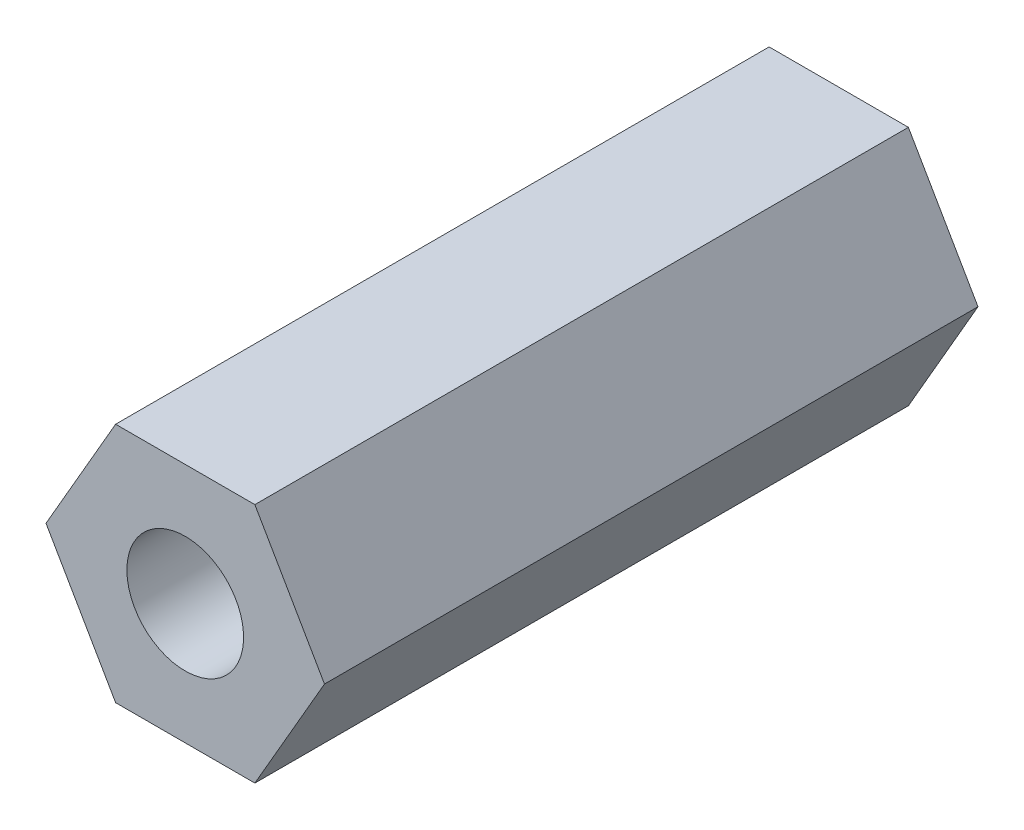
ISO-10303-21;
HEADER;
FILE_DESCRIPTION(('STEP AP214'),'2;1');
FILE_NAME('part.step','',(''),(''),'','','');
FILE_SCHEMA(('AUTOMOTIVE_DESIGN { 1 0 10303 214 1 1 1 1 }'));
ENDSEC;
DATA;
#1=APPLICATION_CONTEXT('core data for automotive mechanical design processes');
#2=APPLICATION_PROTOCOL_DEFINITION('international standard','automotive_design',2000,#1);
#3=PRODUCT_CONTEXT('',#1,'mechanical');
#4=PRODUCT('Part','Part','',(#3));
#5=PRODUCT_RELATED_PRODUCT_CATEGORY('part','',(#4));
#6=PRODUCT_DEFINITION_FORMATION('','',#4);
#7=PRODUCT_DEFINITION_CONTEXT('part definition',#1,'design');
#8=PRODUCT_DEFINITION('design','',#6,#7);
#9=PRODUCT_DEFINITION_SHAPE('','',#8);
#10=(LENGTH_UNIT() NAMED_UNIT(*) SI_UNIT(.MILLI.,.METRE.));
#11=(NAMED_UNIT(*) PLANE_ANGLE_UNIT() SI_UNIT($,.RADIAN.));
#12=(NAMED_UNIT(*) SI_UNIT($,.STERADIAN.) SOLID_ANGLE_UNIT());
#13=UNCERTAINTY_MEASURE_WITH_UNIT(LENGTH_MEASURE(1.E-05),#10,'distance_accuracy_value','');
#14=(GEOMETRIC_REPRESENTATION_CONTEXT(3) GLOBAL_UNCERTAINTY_ASSIGNED_CONTEXT((#13)) GLOBAL_UNIT_ASSIGNED_CONTEXT((#10,
#11,#12)) REPRESENTATION_CONTEXT('',''));
#15=CARTESIAN_POINT('',(0.,0.,0.));
#16=DIRECTION('',(0.,0.,1.));
#17=DIRECTION('',(1.,0.,0.));
#18=AXIS2_PLACEMENT_3D('',#15,#16,#17);
#19=CARTESIAN_POINT('',(0.,0.,0.));
#20=DIRECTION('',(0.,0.,1.));
#21=DIRECTION('',(1.,0.,0.));
#22=AXIS2_PLACEMENT_3D('',#19,#20,#21);
#23=PLANE('',#22);
#24=DIRECTION('',(1.,0.,0.));
#25=VECTOR('',#24,1.);
#26=CARTESIAN_POINT('',(-1.78978583448784,-3.1,0.));
#27=LINE('',#26,#25);
#28=CARTESIAN_POINT('',(-1.78978583448784,-3.1,0.));
#29=VERTEX_POINT('',#28);
#30=CARTESIAN_POINT('',(1.78978583448784,-3.1,0.));
#31=VERTEX_POINT('',#30);
#32=EDGE_CURVE('E48',#29,#31,#27,.T.);
#33=ORIENTED_EDGE('',*,*,#32,.F.);
#34=DIRECTION('',(0.5,-0.866025403784439,0.));
#35=VECTOR('',#34,1.);
#36=CARTESIAN_POINT('',(-3.57957166897568,0.,0.));
#37=LINE('',#36,#35);
#38=CARTESIAN_POINT('',(-3.57957166897568,0.,0.));
#39=VERTEX_POINT('',#38);
#40=EDGE_CURVE('E65',#39,#29,#37,.T.);
#41=ORIENTED_EDGE('',*,*,#40,.F.);
#42=DIRECTION('',(-0.5,-0.866025403784439,0.));
#43=VECTOR('',#42,1.);
#44=CARTESIAN_POINT('',(-1.78978583448784,3.1,0.));
#45=LINE('',#44,#43);
#46=CARTESIAN_POINT('',(-1.78978583448784,3.1,0.));
#47=VERTEX_POINT('',#46);
#48=EDGE_CURVE('E158',#47,#39,#45,.T.);
#49=ORIENTED_EDGE('',*,*,#48,.F.);
#50=DIRECTION('',(-1.,0.,0.));
#51=VECTOR('',#50,1.);
#52=CARTESIAN_POINT('',(1.78978583448784,3.1,0.));
#53=LINE('',#52,#51);
#54=CARTESIAN_POINT('',(1.78978583448784,3.1,0.));
#55=VERTEX_POINT('',#54);
#56=EDGE_CURVE('E85',#55,#47,#53,.T.);
#57=ORIENTED_EDGE('',*,*,#56,.F.);
#58=DIRECTION('',(-0.5,0.866025403784439,0.));
#59=VECTOR('',#58,1.);
#60=CARTESIAN_POINT('',(3.57957166897568,0.,0.));
#61=LINE('',#60,#59);
#62=CARTESIAN_POINT('',(3.57957166897568,0.,0.));
#63=VERTEX_POINT('',#62);
#64=EDGE_CURVE('E80',#63,#55,#61,.T.);
#65=ORIENTED_EDGE('',*,*,#64,.F.);
#66=DIRECTION('',(0.5,0.866025403784439,0.));
#67=VECTOR('',#66,1.);
#68=CARTESIAN_POINT('',(1.78978583448784,-3.1,0.));
#69=LINE('',#68,#67);
#70=EDGE_CURVE('E150',#31,#63,#69,.T.);
#71=ORIENTED_EDGE('',*,*,#70,.F.);
#72=EDGE_LOOP('',(#33,#41,#49,#57,#65,#71));
#73=FACE_BOUND('',#72,.T.);
#74=CARTESIAN_POINT('',(0.,0.,0.));
#75=DIRECTION('',(0.,0.,1.));
#76=DIRECTION('',(1.,0.,0.));
#77=AXIS2_PLACEMENT_3D('',#74,#75,#76);
#78=CIRCLE('',#77,1.85);
#79=CARTESIAN_POINT('',(1.85,-1.16102705726273E-08,0.));
#80=VERTEX_POINT('',#79);
#81=EDGE_CURVE('E11',#80,#80,#78,.T.);
#82=ORIENTED_EDGE('',*,*,#81,.T.);
#83=EDGE_LOOP('',(#82));
#84=FACE_BOUND('',#83,.T.);
#85=ADVANCED_FACE('F39',(#73,#84),#23,.F.);
#86=CARTESIAN_POINT('',(-1.78978583448784,-3.1,0.));
#87=DIRECTION('',(0.,-1.,0.));
#88=DIRECTION('',(0.,0.,-1.));
#89=AXIS2_PLACEMENT_3D('',#86,#87,#88);
#90=PLANE('',#89);
#91=DIRECTION('',(-1.,0.,0.));
#92=VECTOR('',#91,1.);
#93=CARTESIAN_POINT('',(-12.4874931480861,-3.1,16.8));
#94=LINE('',#93,#92);
#95=CARTESIAN_POINT('',(1.78978583448784,-3.1,16.8));
#96=VERTEX_POINT('',#95);
#97=CARTESIAN_POINT('',(-1.78978583448784,-3.1,16.8));
#98=VERTEX_POINT('',#97);
#99=EDGE_CURVE('E149',#96,#98,#94,.T.);
#100=ORIENTED_EDGE('',*,*,#99,.T.);
#101=DIRECTION('',(0.,0.,1.));
#102=VECTOR('',#101,1.);
#103=CARTESIAN_POINT('',(-1.78978583448784,-3.1,0.));
#104=LINE('',#103,#102);
#105=EDGE_CURVE('E163',#29,#98,#104,.T.);
#106=ORIENTED_EDGE('',*,*,#105,.F.);
#107=ORIENTED_EDGE('',*,*,#32,.T.);
#108=DIRECTION('',(0.,0.,1.));
#109=VECTOR('',#108,1.);
#110=CARTESIAN_POINT('',(1.78978583448784,-3.1,0.));
#111=LINE('',#110,#109);
#112=EDGE_CURVE('E134',#31,#96,#111,.T.);
#113=ORIENTED_EDGE('',*,*,#112,.T.);
#114=EDGE_LOOP('',(#100,#106,#107,#113));
#115=FACE_BOUND('',#114,.T.);
#116=ADVANCED_FACE('F99',(#115),#90,.T.);
#117=CARTESIAN_POINT('',(1.78978583448784,-3.1,0.));
#118=DIRECTION('',(0.866025403784439,-0.5,0.));
#119=DIRECTION('',(0.,0.,-1.));
#120=AXIS2_PLACEMENT_3D('',#117,#118,#119);
#121=PLANE('',#120);
#122=DIRECTION('',(0.5,0.866025403784439,0.));
#123=VECTOR('',#122,1.);
#124=CARTESIAN_POINT('',(1.78978583448784,-3.1,16.8));
#125=LINE('',#124,#123);
#126=CARTESIAN_POINT('',(3.57957166897568,0.,16.8));
#127=VERTEX_POINT('',#126);
#128=EDGE_CURVE('E132',#96,#127,#125,.T.);
#129=ORIENTED_EDGE('',*,*,#128,.F.);
#130=ORIENTED_EDGE('',*,*,#112,.F.);
#131=ORIENTED_EDGE('',*,*,#70,.T.);
#132=DIRECTION('',(0.,0.,1.));
#133=VECTOR('',#132,1.);
#134=CARTESIAN_POINT('',(3.57957166897568,0.,0.));
#135=LINE('',#134,#133);
#136=EDGE_CURVE('E136',#63,#127,#135,.T.);
#137=ORIENTED_EDGE('',*,*,#136,.T.);
#138=EDGE_LOOP('',(#129,#130,#131,#137));
#139=FACE_BOUND('',#138,.T.);
#140=ADVANCED_FACE('F104',(#139),#121,.T.);
#141=CARTESIAN_POINT('',(3.57957166897568,0.,0.));
#142=DIRECTION('',(0.866025403784439,0.5,0.));
#143=DIRECTION('',(0.,0.,-1.));
#144=AXIS2_PLACEMENT_3D('',#141,#142,#143);
#145=PLANE('',#144);
#146=DIRECTION('',(-0.5,0.866025403784439,0.));
#147=VECTOR('',#146,1.);
#148=CARTESIAN_POINT('',(3.57957166897568,0.,16.8));
#149=LINE('',#148,#147);
#150=CARTESIAN_POINT('',(1.78978583448784,3.1,16.8));
#151=VERTEX_POINT('',#150);
#152=EDGE_CURVE('E144',#127,#151,#149,.T.);
#153=ORIENTED_EDGE('',*,*,#152,.F.);
#154=ORIENTED_EDGE('',*,*,#136,.F.);
#155=ORIENTED_EDGE('',*,*,#64,.T.);
#156=DIRECTION('',(0.,0.,1.));
#157=VECTOR('',#156,1.);
#158=CARTESIAN_POINT('',(1.78978583448784,3.1,0.));
#159=LINE('',#158,#157);
#160=EDGE_CURVE('E160',#55,#151,#159,.T.);
#161=ORIENTED_EDGE('',*,*,#160,.T.);
#162=EDGE_LOOP('',(#153,#154,#155,#161));
#163=FACE_BOUND('',#162,.T.);
#164=ADVANCED_FACE('F41',(#163),#145,.T.);
#165=CARTESIAN_POINT('',(1.78978583448784,3.1,0.));
#166=DIRECTION('',(0.,1.,0.));
#167=DIRECTION('',(0.,0.,1.));
#168=AXIS2_PLACEMENT_3D('',#165,#166,#167);
#169=PLANE('',#168);
#170=DIRECTION('',(-1.,0.,0.));
#171=VECTOR('',#170,1.);
#172=CARTESIAN_POINT('',(-12.4874931480861,3.1,16.8));
#173=LINE('',#172,#171);
#174=CARTESIAN_POINT('',(-1.78978583448784,3.1,16.8));
#175=VERTEX_POINT('',#174);
#176=EDGE_CURVE('E178',#151,#175,#173,.T.);
#177=ORIENTED_EDGE('',*,*,#176,.F.);
#178=ORIENTED_EDGE('',*,*,#160,.F.);
#179=ORIENTED_EDGE('',*,*,#56,.T.);
#180=DIRECTION('',(0.,0.,1.));
#181=VECTOR('',#180,1.);
#182=CARTESIAN_POINT('',(-1.78978583448784,3.1,0.));
#183=LINE('',#182,#181);
#184=EDGE_CURVE('E155',#47,#175,#183,.T.);
#185=ORIENTED_EDGE('',*,*,#184,.T.);
#186=EDGE_LOOP('',(#177,#178,#179,#185));
#187=FACE_BOUND('',#186,.T.);
#188=ADVANCED_FACE('F115',(#187),#169,.T.);
#189=CARTESIAN_POINT('',(-1.78978583448784,3.1,0.));
#190=DIRECTION('',(-0.866025403784439,0.5,0.));
#191=DIRECTION('',(0.,0.,1.));
#192=AXIS2_PLACEMENT_3D('',#189,#190,#191);
#193=PLANE('',#192);
#194=DIRECTION('',(-0.5,-0.866025403784439,0.));
#195=VECTOR('',#194,1.);
#196=CARTESIAN_POINT('',(-1.78978583448784,3.1,16.8));
#197=LINE('',#196,#195);
#198=CARTESIAN_POINT('',(-3.57957166897568,0.,16.8));
#199=VERTEX_POINT('',#198);
#200=EDGE_CURVE('E56',#175,#199,#197,.T.);
#201=ORIENTED_EDGE('',*,*,#200,.F.);
#202=ORIENTED_EDGE('',*,*,#184,.F.);
#203=ORIENTED_EDGE('',*,*,#48,.T.);
#204=DIRECTION('',(0.,0.,1.));
#205=VECTOR('',#204,1.);
#206=CARTESIAN_POINT('',(-3.57957166897568,0.,0.));
#207=LINE('',#206,#205);
#208=EDGE_CURVE('E162',#39,#199,#207,.T.);
#209=ORIENTED_EDGE('',*,*,#208,.T.);
#210=EDGE_LOOP('',(#201,#202,#203,#209));
#211=FACE_BOUND('',#210,.T.);
#212=ADVANCED_FACE('F118',(#211),#193,.T.);
#213=CARTESIAN_POINT('',(-3.57957166897568,0.,0.));
#214=DIRECTION('',(-0.866025403784439,-0.5,0.));
#215=DIRECTION('',(0.,0.,1.));
#216=AXIS2_PLACEMENT_3D('',#213,#214,#215);
#217=PLANE('',#216);
#218=DIRECTION('',(0.5,-0.866025403784439,0.));
#219=VECTOR('',#218,1.);
#220=CARTESIAN_POINT('',(-3.57957166897568,0.,16.8));
#221=LINE('',#220,#219);
#222=EDGE_CURVE('E182',#199,#98,#221,.T.);
#223=ORIENTED_EDGE('',*,*,#222,.F.);
#224=ORIENTED_EDGE('',*,*,#208,.F.);
#225=ORIENTED_EDGE('',*,*,#40,.T.);
#226=ORIENTED_EDGE('',*,*,#105,.T.);
#227=EDGE_LOOP('',(#223,#224,#225,#226));
#228=FACE_BOUND('',#227,.T.);
#229=ADVANCED_FACE('F113',(#228),#217,.T.);
#230=CARTESIAN_POINT('',(0.,0.,50.8));
#231=DIRECTION('',(0.,0.,1.));
#232=DIRECTION('',(-1.,0.,0.));
#233=AXIS2_PLACEMENT_3D('',#230,#231,#232);
#234=CYLINDRICAL_SURFACE('',#233,1.5);
#235=CARTESIAN_POINT('',(0.,0.,16.8));
#236=DIRECTION('',(0.,0.,-1.));
#237=DIRECTION('',(-1.,0.,0.));
#238=AXIS2_PLACEMENT_3D('',#235,#236,#237);
#239=CIRCLE('',#238,1.5);
#240=CARTESIAN_POINT('',(-1.5,0.,16.8));
#241=VERTEX_POINT('',#240);
#242=EDGE_CURVE('E43',#241,#241,#239,.F.);
#243=ORIENTED_EDGE('',*,*,#242,.T.);
#244=EDGE_LOOP('',(#243));
#245=FACE_BOUND('',#244,.T.);
#246=CARTESIAN_POINT('',(0.,0.,0.35));
#247=DIRECTION('',(0.,0.,1.));
#248=DIRECTION('',(1.,0.,0.));
#249=AXIS2_PLACEMENT_3D('',#246,#247,#248);
#250=CIRCLE('',#249,1.5);
#251=CARTESIAN_POINT('',(-1.5,-6.23831897903646E-08,0.35));
#252=VERTEX_POINT('',#251);
#253=EDGE_CURVE('E143',#252,#252,#250,.T.);
#254=ORIENTED_EDGE('',*,*,#253,.F.);
#255=EDGE_LOOP('',(#254));
#256=FACE_BOUND('',#255,.T.);
#257=ADVANCED_FACE('F110',(#245,#256),#234,.F.);
#258=CARTESIAN_POINT('',(0.,0.,-1.15064646699636E-09));
#259=DIRECTION('',(0.,0.,-1.));
#260=DIRECTION('',(0.,-1.,0.));
#261=AXIS2_PLACEMENT_3D('',#258,#259,#260);
#262=CONICAL_SURFACE('',#261,1.85000000115065,0.785398163397446);
#263=ORIENTED_EDGE('',*,*,#81,.F.);
#264=EDGE_LOOP('',(#263));
#265=FACE_BOUND('',#264,.T.);
#266=ORIENTED_EDGE('',*,*,#253,.T.);
#267=EDGE_LOOP('',(#266));
#268=FACE_BOUND('',#267,.T.);
#269=ADVANCED_FACE('F95',(#265,#268),#262,.F.);
#270=CARTESIAN_POINT('',(-12.4874931480861,-3.1,16.8));
#271=DIRECTION('',(0.,0.,-1.));
#272=DIRECTION('',(-1.,0.,0.));
#273=AXIS2_PLACEMENT_3D('',#270,#271,#272);
#274=PLANE('',#273);
#275=ORIENTED_EDGE('',*,*,#128,.T.);
#276=ORIENTED_EDGE('',*,*,#152,.T.);
#277=ORIENTED_EDGE('',*,*,#176,.T.);
#278=ORIENTED_EDGE('',*,*,#200,.T.);
#279=ORIENTED_EDGE('',*,*,#222,.T.);
#280=ORIENTED_EDGE('',*,*,#99,.F.);
#281=EDGE_LOOP('',(#275,#276,#277,#278,#279,#280));
#282=FACE_BOUND('',#281,.T.);
#283=ORIENTED_EDGE('',*,*,#242,.F.);
#284=EDGE_LOOP('',(#283));
#285=FACE_BOUND('',#284,.T.);
#286=ADVANCED_FACE('F185',(#282,#285),#274,.F.);
#287=CLOSED_SHELL('',(#85,#116,#140,#164,#188,#212,#229,#257,#269,#286));
#288=MANIFOLD_SOLID_BREP('B2',#287);
#289=ADVANCED_BREP_SHAPE_REPRESENTATION('',(#18,#288),#14);
#290=SHAPE_DEFINITION_REPRESENTATION(#9,#289);
ENDSEC;
END-ISO-10303-21;
